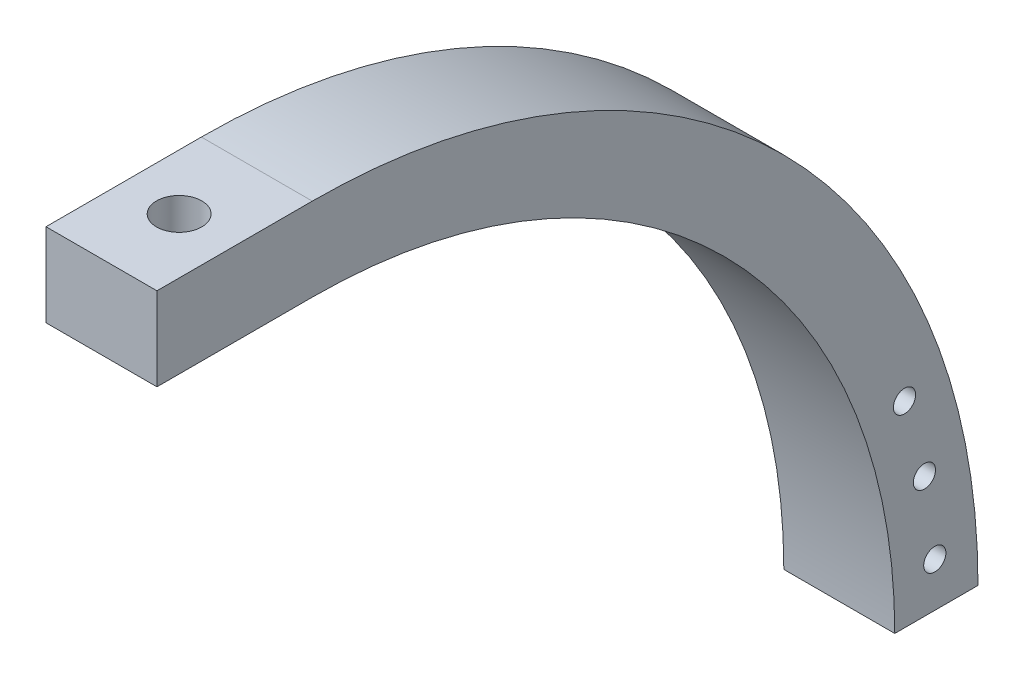
ISO-10303-21;
HEADER;
FILE_DESCRIPTION(('STEP AP214'),'2;1');
FILE_NAME('part.step','',(''),(''),'','','');
FILE_SCHEMA(('AUTOMOTIVE_DESIGN { 1 0 10303 214 1 1 1 1 }'));
ENDSEC;
DATA;
#1=APPLICATION_CONTEXT('core data for automotive mechanical design processes');
#2=APPLICATION_PROTOCOL_DEFINITION('international standard','automotive_design',2000,#1);
#3=PRODUCT_CONTEXT('',#1,'mechanical');
#4=PRODUCT('Part','Part','',(#3));
#5=PRODUCT_RELATED_PRODUCT_CATEGORY('part','',(#4));
#6=PRODUCT_DEFINITION_FORMATION('','',#4);
#7=PRODUCT_DEFINITION_CONTEXT('part definition',#1,'design');
#8=PRODUCT_DEFINITION('design','',#6,#7);
#9=PRODUCT_DEFINITION_SHAPE('','',#8);
#10=(LENGTH_UNIT() NAMED_UNIT(*) SI_UNIT(.MILLI.,.METRE.));
#11=(NAMED_UNIT(*) PLANE_ANGLE_UNIT() SI_UNIT($,.RADIAN.));
#12=(NAMED_UNIT(*) SI_UNIT($,.STERADIAN.) SOLID_ANGLE_UNIT());
#13=UNCERTAINTY_MEASURE_WITH_UNIT(LENGTH_MEASURE(1.E-05),#10,'distance_accuracy_value','');
#14=(GEOMETRIC_REPRESENTATION_CONTEXT(3) GLOBAL_UNCERTAINTY_ASSIGNED_CONTEXT((#13)) GLOBAL_UNIT_ASSIGNED_CONTEXT((#10,
#11,#12)) REPRESENTATION_CONTEXT('',''));
#15=CARTESIAN_POINT('',(0.,0.,0.));
#16=DIRECTION('',(0.,0.,1.));
#17=DIRECTION('',(1.,0.,0.));
#18=AXIS2_PLACEMENT_3D('',#15,#16,#17);
#19=CARTESIAN_POINT('',(0.,9.05,0.));
#20=DIRECTION('',(0.,1.,0.));
#21=DIRECTION('',(0.,0.,1.));
#22=AXIS2_PLACEMENT_3D('',#19,#20,#21);
#23=PLANE('',#22);
#24=DIRECTION('',(0.,0.,-1.));
#25=VECTOR('',#24,1.);
#26=CARTESIAN_POINT('',(-10.,9.05000000000002,-14.));
#27=LINE('',#26,#25);
#28=CARTESIAN_POINT('',(-10.,9.05000000000002,-119.));
#29=VERTEX_POINT('',#28);
#30=CARTESIAN_POINT('',(-10.,9.05000000000002,-134.));
#31=VERTEX_POINT('',#30);
#32=EDGE_CURVE('E12',#29,#31,#27,.T.);
#33=ORIENTED_EDGE('',*,*,#32,.T.);
#34=DIRECTION('',(1.,0.,0.));
#35=VECTOR('',#34,1.);
#36=CARTESIAN_POINT('',(-10.,9.05,-134.));
#37=LINE('',#36,#35);
#38=CARTESIAN_POINT('',(10.,9.05000000000002,-134.));
#39=VERTEX_POINT('',#38);
#40=EDGE_CURVE('E45',#31,#39,#37,.T.);
#41=ORIENTED_EDGE('',*,*,#40,.T.);
#42=DIRECTION('',(0.,0.,-1.));
#43=VECTOR('',#42,1.);
#44=CARTESIAN_POINT('',(10.,9.05000000000002,-14.));
#45=LINE('',#44,#43);
#46=CARTESIAN_POINT('',(10.,9.05000000000002,-119.));
#47=VERTEX_POINT('',#46);
#48=EDGE_CURVE('E59',#47,#39,#45,.T.);
#49=ORIENTED_EDGE('',*,*,#48,.F.);
#50=DIRECTION('',(1.,0.,0.));
#51=VECTOR('',#50,1.);
#52=CARTESIAN_POINT('',(-10.,9.05,-119.));
#53=LINE('',#52,#51);
#54=EDGE_CURVE('E52',#47,#29,#53,.F.);
#55=ORIENTED_EDGE('',*,*,#54,.T.);
#56=EDGE_LOOP('',(#33,#41,#49,#55));
#57=FACE_BOUND('',#56,.T.);
#58=ADVANCED_FACE('F38',(#57),#23,.F.);
#59=CARTESIAN_POINT('',(-10.,117.05,-14.));
#60=DIRECTION('',(0.,-1.,0.));
#61=DIRECTION('',(0.,0.,-1.));
#62=AXIS2_PLACEMENT_3D('',#59,#60,#61);
#63=PLANE('',#62);
#64=CARTESIAN_POINT('',(0.,117.05,0.));
#65=DIRECTION('',(0.,1.,0.));
#66=DIRECTION('',(0.,0.,1.));
#67=AXIS2_PLACEMENT_3D('',#64,#65,#66);
#68=CIRCLE('',#67,1.675);
#69=CARTESIAN_POINT('',(0.,117.05,1.67499999999994));
#70=VERTEX_POINT('',#69);
#71=EDGE_CURVE('E218',#70,#70,#68,.T.);
#72=ORIENTED_EDGE('',*,*,#71,.F.);
#73=EDGE_LOOP('',(#72));
#74=FACE_BOUND('',#73,.T.);
#75=CARTESIAN_POINT('',(0.,117.05,0.));
#76=DIRECTION('',(0.,-1.,0.));
#77=DIRECTION('',(0.,0.,-1.));
#78=AXIS2_PLACEMENT_3D('',#75,#76,#77);
#79=CIRCLE('',#78,4.075);
#80=CARTESIAN_POINT('',(0.,117.05,-4.075));
#81=VERTEX_POINT('',#80);
#82=EDGE_CURVE('E231',#81,#81,#79,.F.);
#83=ORIENTED_EDGE('',*,*,#82,.T.);
#84=EDGE_LOOP('',(#83));
#85=FACE_BOUND('',#84,.T.);
#86=ADVANCED_FACE('F174',(#74,#85),#63,.F.);
#87=CARTESIAN_POINT('',(0.,109.31238456605,0.));
#88=DIRECTION('',(0.,1.,0.));
#89=DIRECTION('',(0.,0.,1.));
#90=AXIS2_PLACEMENT_3D('',#87,#88,#89);
#91=CYLINDRICAL_SURFACE('',#90,1.675);
#92=ORIENTED_EDGE('',*,*,#71,.T.);
#93=EDGE_LOOP('',(#92));
#94=FACE_BOUND('',#93,.T.);
#95=CARTESIAN_POINT('',(0.,114.05,0.));
#96=DIRECTION('',(0.,-1.,0.));
#97=DIRECTION('',(0.,0.,-1.));
#98=AXIS2_PLACEMENT_3D('',#95,#96,#97);
#99=CIRCLE('',#98,1.675);
#100=CARTESIAN_POINT('',(0.,114.05,-1.67500000000006));
#101=VERTEX_POINT('',#100);
#102=EDGE_CURVE('E221',#101,#101,#99,.F.);
#103=ORIENTED_EDGE('',*,*,#102,.F.);
#104=EDGE_LOOP('',(#103));
#105=FACE_BOUND('',#104,.T.);
#106=ADVANCED_FACE('F178',(#94,#105),#91,.F.);
#107=CARTESIAN_POINT('',(0.,102.524159466659,0.));
#108=DIRECTION('',(0.,1.,0.));
#109=DIRECTION('',(0.,0.,1.));
#110=AXIS2_PLACEMENT_3D('',#107,#108,#109);
#111=CYLINDRICAL_SURFACE('',#110,4.075);
#112=CARTESIAN_POINT('',(0.,129.05,0.));
#113=DIRECTION('',(0.,1.,0.));
#114=DIRECTION('',(0.,0.,1.));
#115=AXIS2_PLACEMENT_3D('',#112,#113,#114);
#116=CIRCLE('',#115,4.075);
#117=CARTESIAN_POINT('',(0.,129.05,4.075));
#118=VERTEX_POINT('',#117);
#119=EDGE_CURVE('E228',#118,#118,#116,.T.);
#120=ORIENTED_EDGE('',*,*,#119,.T.);
#121=EDGE_LOOP('',(#120));
#122=FACE_BOUND('',#121,.T.);
#123=ORIENTED_EDGE('',*,*,#82,.F.);
#124=EDGE_LOOP('',(#123));
#125=FACE_BOUND('',#124,.T.);
#126=ADVANCED_FACE('F170',(#122,#125),#111,.F.);
#127=CARTESIAN_POINT('',(-10.,114.05,-14.));
#128=DIRECTION('',(0.,-1.,0.));
#129=DIRECTION('',(0.,0.,-1.));
#130=AXIS2_PLACEMENT_3D('',#127,#128,#129);
#131=PLANE('',#130);
#132=ORIENTED_EDGE('',*,*,#102,.T.);
#133=EDGE_LOOP('',(#132));
#134=FACE_BOUND('',#133,.T.);
#135=DIRECTION('',(1.,0.,0.));
#136=VECTOR('',#135,1.);
#137=CARTESIAN_POINT('',(-10.,114.05,-14.));
#138=LINE('',#137,#136);
#139=CARTESIAN_POINT('',(-10.,114.05,-14.));
#140=VERTEX_POINT('',#139);
#141=CARTESIAN_POINT('',(10.,114.05,-14.));
#142=VERTEX_POINT('',#141);
#143=EDGE_CURVE('E130',#140,#142,#138,.T.);
#144=ORIENTED_EDGE('',*,*,#143,.T.);
#145=DIRECTION('',(0.,0.,-1.));
#146=VECTOR('',#145,1.);
#147=CARTESIAN_POINT('',(10.,114.05,-14.));
#148=LINE('',#147,#146);
#149=CARTESIAN_POINT('',(10.,114.05,14.));
#150=VERTEX_POINT('',#149);
#151=EDGE_CURVE('E114',#150,#142,#148,.T.);
#152=ORIENTED_EDGE('',*,*,#151,.F.);
#153=DIRECTION('',(1.,0.,0.));
#154=VECTOR('',#153,1.);
#155=CARTESIAN_POINT('',(-10.,114.05,14.));
#156=LINE('',#155,#154);
#157=CARTESIAN_POINT('',(-10.,114.05,14.));
#158=VERTEX_POINT('',#157);
#159=EDGE_CURVE('E132',#158,#150,#156,.T.);
#160=ORIENTED_EDGE('',*,*,#159,.F.);
#161=DIRECTION('',(0.,0.,-1.));
#162=VECTOR('',#161,1.);
#163=CARTESIAN_POINT('',(-10.,114.05,-14.));
#164=LINE('',#163,#162);
#165=EDGE_CURVE('E109',#158,#140,#164,.T.);
#166=ORIENTED_EDGE('',*,*,#165,.T.);
#167=EDGE_LOOP('',(#144,#152,#160,#166));
#168=FACE_BOUND('',#167,.T.);
#169=ADVANCED_FACE('F158',(#134,#168),#131,.T.);
#170=CARTESIAN_POINT('',(-10.,114.05,14.));
#171=DIRECTION('',(0.,0.,1.));
#172=DIRECTION('',(1.,0.,0.));
#173=AXIS2_PLACEMENT_3D('',#170,#171,#172);
#174=PLANE('',#173);
#175=ORIENTED_EDGE('',*,*,#159,.T.);
#176=DIRECTION('',(0.,-1.,0.));
#177=VECTOR('',#176,1.);
#178=CARTESIAN_POINT('',(10.,114.05,14.));
#179=LINE('',#178,#177);
#180=CARTESIAN_POINT('',(10.,129.05,14.));
#181=VERTEX_POINT('',#180);
#182=EDGE_CURVE('E112',#181,#150,#179,.T.);
#183=ORIENTED_EDGE('',*,*,#182,.F.);
#184=DIRECTION('',(1.,0.,0.));
#185=VECTOR('',#184,1.);
#186=CARTESIAN_POINT('',(-10.,129.05,14.));
#187=LINE('',#186,#185);
#188=CARTESIAN_POINT('',(-10.,129.05,14.));
#189=VERTEX_POINT('',#188);
#190=EDGE_CURVE('E108',#189,#181,#187,.T.);
#191=ORIENTED_EDGE('',*,*,#190,.F.);
#192=DIRECTION('',(0.,-1.,0.));
#193=VECTOR('',#192,1.);
#194=CARTESIAN_POINT('',(-10.,114.05,14.));
#195=LINE('',#194,#193);
#196=EDGE_CURVE('E125',#189,#158,#195,.T.);
#197=ORIENTED_EDGE('',*,*,#196,.T.);
#198=EDGE_LOOP('',(#175,#183,#191,#197));
#199=FACE_BOUND('',#198,.T.);
#200=ADVANCED_FACE('F160',(#199),#174,.T.);
#201=CARTESIAN_POINT('',(-10.,129.05,14.));
#202=DIRECTION('',(0.,1.,0.));
#203=DIRECTION('',(0.,0.,1.));
#204=AXIS2_PLACEMENT_3D('',#201,#202,#203);
#205=PLANE('',#204);
#206=ORIENTED_EDGE('',*,*,#119,.F.);
#207=EDGE_LOOP('',(#206));
#208=FACE_BOUND('',#207,.T.);
#209=ORIENTED_EDGE('',*,*,#190,.T.);
#210=DIRECTION('',(0.,0.,1.));
#211=VECTOR('',#210,1.);
#212=CARTESIAN_POINT('',(10.,129.05,14.));
#213=LINE('',#212,#211);
#214=CARTESIAN_POINT('',(10.,129.05,-14.));
#215=VERTEX_POINT('',#214);
#216=EDGE_CURVE('E95',#215,#181,#213,.T.);
#217=ORIENTED_EDGE('',*,*,#216,.F.);
#218=DIRECTION('',(1.,0.,0.));
#219=VECTOR('',#218,1.);
#220=CARTESIAN_POINT('',(-10.,129.05,-14.));
#221=LINE('',#220,#219);
#222=CARTESIAN_POINT('',(-10.,129.05,-14.));
#223=VERTEX_POINT('',#222);
#224=EDGE_CURVE('E101',#223,#215,#221,.T.);
#225=ORIENTED_EDGE('',*,*,#224,.F.);
#226=DIRECTION('',(0.,0.,1.));
#227=VECTOR('',#226,1.);
#228=CARTESIAN_POINT('',(-10.,129.05,14.));
#229=LINE('',#228,#227);
#230=EDGE_CURVE('E123',#223,#189,#229,.T.);
#231=ORIENTED_EDGE('',*,*,#230,.T.);
#232=EDGE_LOOP('',(#209,#217,#225,#231));
#233=FACE_BOUND('',#232,.T.);
#234=ADVANCED_FACE('F111',(#208,#233),#205,.T.);
#235=CARTESIAN_POINT('',(-10.,9.05000000000002,-14.));
#236=DIRECTION('',(1.,0.,0.));
#237=DIRECTION('',(0.,0.,-1.));
#238=AXIS2_PLACEMENT_3D('',#235,#236,#237);
#239=CYLINDRICAL_SURFACE('',#238,120.);
#240=ORIENTED_EDGE('',*,*,#40,.F.);
#241=CARTESIAN_POINT('',(-10.,9.05000000000002,-14.));
#242=DIRECTION('',(1.,0.,0.));
#243=DIRECTION('',(0.,0.,1.));
#244=AXIS2_PLACEMENT_3D('',#241,#242,#243);
#245=CIRCLE('',#244,120.);
#246=EDGE_CURVE('E104',#31,#223,#245,.T.);
#247=ORIENTED_EDGE('',*,*,#246,.T.);
#248=ORIENTED_EDGE('',*,*,#224,.T.);
#249=CARTESIAN_POINT('',(10.,9.05000000000002,-14.));
#250=DIRECTION('',(1.,0.,0.));
#251=DIRECTION('',(0.,0.,1.));
#252=AXIS2_PLACEMENT_3D('',#249,#250,#251);
#253=CIRCLE('',#252,120.);
#254=EDGE_CURVE('E90',#39,#215,#253,.T.);
#255=ORIENTED_EDGE('',*,*,#254,.F.);
#256=EDGE_LOOP('',(#240,#247,#248,#255));
#257=FACE_BOUND('',#256,.T.);
#258=ADVANCED_FACE('F102',(#257),#239,.T.);
#259=CARTESIAN_POINT('',(-10.,9.05000000000002,-14.));
#260=DIRECTION('',(1.,0.,0.));
#261=DIRECTION('',(0.,0.,-1.));
#262=AXIS2_PLACEMENT_3D('',#259,#260,#261);
#263=CYLINDRICAL_SURFACE('',#262,105.);
#264=ORIENTED_EDGE('',*,*,#54,.F.);
#265=CARTESIAN_POINT('',(10.,9.05000000000002,-14.));
#266=DIRECTION('',(-1.,0.,0.));
#267=DIRECTION('',(0.,0.,1.));
#268=AXIS2_PLACEMENT_3D('',#265,#266,#267);
#269=CIRCLE('',#268,105.);
#270=EDGE_CURVE('E98',#142,#47,#269,.T.);
#271=ORIENTED_EDGE('',*,*,#270,.F.);
#272=ORIENTED_EDGE('',*,*,#143,.F.);
#273=CARTESIAN_POINT('',(-10.,9.05000000000002,-14.));
#274=DIRECTION('',(-1.,0.,0.));
#275=DIRECTION('',(0.,0.,1.));
#276=AXIS2_PLACEMENT_3D('',#273,#274,#275);
#277=CIRCLE('',#276,105.);
#278=EDGE_CURVE('E120',#140,#29,#277,.T.);
#279=ORIENTED_EDGE('',*,*,#278,.T.);
#280=EDGE_LOOP('',(#264,#271,#272,#279));
#281=FACE_BOUND('',#280,.T.);
#282=ADVANCED_FACE('F155',(#281),#263,.F.);
#283=CARTESIAN_POINT('',(-99.5,17.05,-126.213761495822));
#284=DIRECTION('',(1.,0.,0.));
#285=DIRECTION('',(0.,0.,-1.));
#286=AXIS2_PLACEMENT_3D('',#283,#284,#285);
#287=CYLINDRICAL_SURFACE('',#286,2.);
#288=CARTESIAN_POINT('',(-9.99999999999999,17.05,-126.213761495822));
#289=DIRECTION('',(-1.,0.,0.));
#290=DIRECTION('',(0.,0.,1.));
#291=AXIS2_PLACEMENT_3D('',#288,#289,#290);
#292=CIRCLE('',#291,2.);
#293=CARTESIAN_POINT('',(-9.99999999999998,17.05,-128.213761495822));
#294=VERTEX_POINT('',#293);
#295=EDGE_CURVE('E138',#294,#294,#292,.T.);
#296=CARTESIAN_POINT('',(9.99999999999999,17.05,-126.213761495822));
#297=DIRECTION('',(-1.,0.,0.));
#298=DIRECTION('',(0.,0.,1.));
#299=AXIS2_PLACEMENT_3D('',#296,#297,#298);
#300=CIRCLE('',#299,2.);
#301=CARTESIAN_POINT('',(10.,17.05,-128.213761495822));
#302=VERTEX_POINT('',#301);
#303=EDGE_CURVE('E135',#302,#302,#300,.T.);
#304=CARTESIAN_POINT('',(-9.99999999999998,17.05,-128.213761495822));
#305=CARTESIAN_POINT('',(-9.79166666666665,17.05,-128.213761495822));
#306=CARTESIAN_POINT('',(-9.58333333333331,17.05,-128.213761495822));
#307=CARTESIAN_POINT('',(-9.16666666666665,17.05,-128.213761495822));
#308=CARTESIAN_POINT('',(-8.95833333333331,17.05,-128.213761495822));
#309=CARTESIAN_POINT('',(-8.54166666666665,17.05,-128.213761495822));
#310=CARTESIAN_POINT('',(-8.33333333333331,17.05,-128.213761495822));
#311=CARTESIAN_POINT('',(-7.91666666666665,17.05,-128.213761495822));
#312=CARTESIAN_POINT('',(-7.70833333333331,17.05,-128.213761495822));
#313=CARTESIAN_POINT('',(-7.29166666666664,17.05,-128.213761495822));
#314=CARTESIAN_POINT('',(-7.08333333333331,17.05,-128.213761495822));
#315=CARTESIAN_POINT('',(-6.66666666666664,17.05,-128.213761495822));
#316=CARTESIAN_POINT('',(-6.45833333333331,17.05,-128.213761495822));
#317=CARTESIAN_POINT('',(-6.04166666666664,17.05,-128.213761495822));
#318=CARTESIAN_POINT('',(-5.83333333333331,17.05,-128.213761495822));
#319=CARTESIAN_POINT('',(-5.41666666666664,17.05,-128.213761495822));
#320=CARTESIAN_POINT('',(-5.20833333333331,17.05,-128.213761495822));
#321=CARTESIAN_POINT('',(-4.79166666666665,17.05,-128.213761495822));
#322=CARTESIAN_POINT('',(-4.58333333333332,17.05,-128.213761495822));
#323=CARTESIAN_POINT('',(-4.16666666666666,17.05,-128.213761495822));
#324=CARTESIAN_POINT('',(-3.95833333333332,17.05,-128.213761495822));
#325=CARTESIAN_POINT('',(-3.54166666666666,17.05,-128.213761495822));
#326=CARTESIAN_POINT('',(-3.33333333333332,17.05,-128.213761495822));
#327=CARTESIAN_POINT('',(-2.91666666666666,17.05,-128.213761495822));
#328=CARTESIAN_POINT('',(-2.70833333333332,17.05,-128.213761495822));
#329=CARTESIAN_POINT('',(-2.29166666666665,17.05,-128.213761495822));
#330=CARTESIAN_POINT('',(-2.08333333333332,17.05,-128.213761495822));
#331=CARTESIAN_POINT('',(-1.66666666666665,17.05,-128.213761495822));
#332=CARTESIAN_POINT('',(-1.45833333333332,17.05,-128.213761495822));
#333=CARTESIAN_POINT('',(-1.04166666666665,17.05,-128.213761495822));
#334=CARTESIAN_POINT('',(-0.83333333333332,17.05,-128.213761495822));
#335=CARTESIAN_POINT('',(-0.416666666666653,17.05,-128.213761495822));
#336=CARTESIAN_POINT('',(-0.20833333333332,17.05,-128.213761495822));
#337=CARTESIAN_POINT('',(0.208333333333347,17.05,-128.213761495822));
#338=CARTESIAN_POINT('',(0.416666666666681,17.05,-128.213761495822));
#339=CARTESIAN_POINT('',(0.833333333333348,17.05,-128.213761495822));
#340=CARTESIAN_POINT('',(1.04166666666668,17.05,-128.213761495822));
#341=CARTESIAN_POINT('',(1.45833333333335,17.05,-128.213761495822));
#342=CARTESIAN_POINT('',(1.66666666666668,17.05,-128.213761495822));
#343=CARTESIAN_POINT('',(2.08333333333335,17.05,-128.213761495822));
#344=CARTESIAN_POINT('',(2.29166666666668,17.05,-128.213761495822));
#345=CARTESIAN_POINT('',(2.70833333333335,17.05,-128.213761495822));
#346=CARTESIAN_POINT('',(2.91666666666668,17.05,-128.213761495822));
#347=CARTESIAN_POINT('',(3.33333333333335,17.05,-128.213761495822));
#348=CARTESIAN_POINT('',(3.54166666666668,17.05,-128.213761495822));
#349=CARTESIAN_POINT('',(3.95833333333335,17.05,-128.213761495822));
#350=CARTESIAN_POINT('',(4.16666666666668,17.05,-128.213761495822));
#351=CARTESIAN_POINT('',(4.58333333333335,17.05,-128.213761495822));
#352=CARTESIAN_POINT('',(4.79166666666668,17.05,-128.213761495822));
#353=CARTESIAN_POINT('',(5.20833333333334,17.05,-128.213761495822));
#354=CARTESIAN_POINT('',(5.41666666666668,17.05,-128.213761495822));
#355=CARTESIAN_POINT('',(5.83333333333335,17.05,-128.213761495822));
#356=CARTESIAN_POINT('',(6.04166666666668,17.05,-128.213761495822));
#357=CARTESIAN_POINT('',(6.45833333333334,17.05,-128.213761495822));
#358=CARTESIAN_POINT('',(6.66666666666667,17.05,-128.213761495822));
#359=CARTESIAN_POINT('',(7.08333333333334,17.05,-128.213761495822));
#360=CARTESIAN_POINT('',(7.29166666666667,17.05,-128.213761495822));
#361=CARTESIAN_POINT('',(7.70833333333334,17.05,-128.213761495822));
#362=CARTESIAN_POINT('',(7.91666666666667,17.05,-128.213761495822));
#363=CARTESIAN_POINT('',(8.33333333333334,17.05,-128.213761495822));
#364=CARTESIAN_POINT('',(8.54166666666667,17.05,-128.213761495822));
#365=CARTESIAN_POINT('',(8.95833333333334,17.05,-128.213761495822));
#366=CARTESIAN_POINT('',(9.16666666666667,17.05,-128.213761495822));
#367=CARTESIAN_POINT('',(9.58333333333334,17.05,-128.213761495822));
#368=CARTESIAN_POINT('',(9.79166666666668,17.05,-128.213761495822));
#369=CARTESIAN_POINT('',(10.,17.05,-128.213761495822));
#370=B_SPLINE_CURVE_WITH_KNOTS('',3,(#304,#305,#306,#307,#308,#309,#310,#311,#312,#313,#314,
#315,#316,#317,#318,#319,#320,#321,#322,#323,#324,#325,#326,#327,#328,#329,#330,#331,#332,#333,
#334,#335,#336,#337,#338,#339,#340,#341,#342,#343,#344,#345,#346,#347,#348,#349,#350,#351,#352,
#353,#354,#355,#356,#357,#358,#359,#360,#361,#362,#363,#364,#365,#366,#367,#368,#369),
.UNSPECIFIED.,.F.,.F.,(4,2,2,2,2,2,2,2,2,2,2,2,2,2,2,2,2,2,2,2,2,2,2,2,2,2,2,2,2,2,2,2,4),(0.,
0.625000000000001,1.25,1.875,2.5,3.125,3.75,4.375,5.,5.62499999999999,6.24999999999999,
6.87499999999999,7.49999999999999,8.12499999999999,8.74999999999999,9.37499999999999,
9.99999999999999,10.625,11.25,11.875,12.5,13.125,13.75,14.375,15.,15.625,16.25,16.875,17.5,
18.125,18.75,19.375,20.),.UNSPECIFIED.);
#371=EDGE_CURVE('BSEAM196',#294,#302,#370,.T.);
#372=ORIENTED_EDGE('',*,*,#295,.T.);
#373=ORIENTED_EDGE('',*,*,#303,.F.);
#374=ORIENTED_EDGE('',*,*,#371,.T.);
#375=ORIENTED_EDGE('',*,*,#371,.F.);
#376=EDGE_LOOP('',(#372,#374,#373,#375));
#377=FACE_BOUND('',#376,.T.);
#378=ADVANCED_FACE('F196',(#377),#287,.F.);
#379=CARTESIAN_POINT('',(-99.5,30.9243003232221,-124.341920011871));
#380=DIRECTION('',(1.,0.,0.));
#381=DIRECTION('',(0.,0.,-1.));
#382=AXIS2_PLACEMENT_3D('',#379,#380,#381);
#383=CYLINDRICAL_SURFACE('',#382,2.);
#384=CARTESIAN_POINT('',(-9.99999999999999,30.9243003232221,-124.341920011871));
#385=DIRECTION('',(-1.,0.,0.));
#386=DIRECTION('',(0.,0.,1.));
#387=AXIS2_PLACEMENT_3D('',#384,#385,#386);
#388=CIRCLE('',#387,2.);
#389=CARTESIAN_POINT('',(-9.99999999999998,30.9243003232221,-126.341920011871));
#390=VERTEX_POINT('',#389);
#391=EDGE_CURVE('E142',#390,#390,#388,.T.);
#392=CARTESIAN_POINT('',(9.99999999999999,30.9243003232221,-124.341920011871));
#393=DIRECTION('',(-1.,0.,0.));
#394=DIRECTION('',(0.,0.,1.));
#395=AXIS2_PLACEMENT_3D('',#392,#393,#394);
#396=CIRCLE('',#395,2.);
#397=CARTESIAN_POINT('',(10.,30.9243003232221,-126.341920011871));
#398=VERTEX_POINT('',#397);
#399=EDGE_CURVE('E139',#398,#398,#396,.T.);
#400=CARTESIAN_POINT('',(-9.99999999999998,30.9243003232221,-126.341920011871));
#401=CARTESIAN_POINT('',(-9.79166666666665,30.9243003232221,-126.341920011871));
#402=CARTESIAN_POINT('',(-9.58333333333331,30.9243003232221,-126.341920011871));
#403=CARTESIAN_POINT('',(-9.16666666666665,30.9243003232221,-126.341920011871));
#404=CARTESIAN_POINT('',(-8.95833333333331,30.9243003232221,-126.341920011871));
#405=CARTESIAN_POINT('',(-8.54166666666665,30.9243003232221,-126.341920011871));
#406=CARTESIAN_POINT('',(-8.33333333333331,30.9243003232221,-126.341920011871));
#407=CARTESIAN_POINT('',(-7.91666666666665,30.9243003232221,-126.341920011871));
#408=CARTESIAN_POINT('',(-7.70833333333331,30.9243003232221,-126.341920011871));
#409=CARTESIAN_POINT('',(-7.29166666666664,30.9243003232221,-126.341920011871));
#410=CARTESIAN_POINT('',(-7.08333333333331,30.9243003232221,-126.341920011871));
#411=CARTESIAN_POINT('',(-6.66666666666664,30.9243003232221,-126.341920011871));
#412=CARTESIAN_POINT('',(-6.45833333333331,30.9243003232221,-126.341920011871));
#413=CARTESIAN_POINT('',(-6.04166666666664,30.9243003232221,-126.341920011871));
#414=CARTESIAN_POINT('',(-5.83333333333331,30.9243003232221,-126.341920011871));
#415=CARTESIAN_POINT('',(-5.41666666666664,30.9243003232221,-126.341920011871));
#416=CARTESIAN_POINT('',(-5.20833333333331,30.9243003232221,-126.341920011871));
#417=CARTESIAN_POINT('',(-4.79166666666665,30.9243003232221,-126.341920011871));
#418=CARTESIAN_POINT('',(-4.58333333333332,30.9243003232221,-126.341920011871));
#419=CARTESIAN_POINT('',(-4.16666666666666,30.9243003232221,-126.341920011871));
#420=CARTESIAN_POINT('',(-3.95833333333332,30.9243003232221,-126.341920011871));
#421=CARTESIAN_POINT('',(-3.54166666666666,30.9243003232221,-126.341920011871));
#422=CARTESIAN_POINT('',(-3.33333333333332,30.9243003232221,-126.341920011871));
#423=CARTESIAN_POINT('',(-2.91666666666666,30.9243003232221,-126.341920011871));
#424=CARTESIAN_POINT('',(-2.70833333333332,30.9243003232221,-126.341920011871));
#425=CARTESIAN_POINT('',(-2.29166666666665,30.9243003232221,-126.341920011871));
#426=CARTESIAN_POINT('',(-2.08333333333332,30.9243003232221,-126.341920011871));
#427=CARTESIAN_POINT('',(-1.66666666666665,30.9243003232221,-126.341920011871));
#428=CARTESIAN_POINT('',(-1.45833333333332,30.9243003232221,-126.341920011871));
#429=CARTESIAN_POINT('',(-1.04166666666665,30.9243003232221,-126.341920011871));
#430=CARTESIAN_POINT('',(-0.83333333333332,30.9243003232221,-126.341920011871));
#431=CARTESIAN_POINT('',(-0.416666666666653,30.9243003232221,-126.341920011871));
#432=CARTESIAN_POINT('',(-0.20833333333332,30.9243003232221,-126.341920011871));
#433=CARTESIAN_POINT('',(0.208333333333347,30.9243003232221,-126.341920011871));
#434=CARTESIAN_POINT('',(0.416666666666681,30.9243003232221,-126.341920011871));
#435=CARTESIAN_POINT('',(0.833333333333348,30.9243003232221,-126.341920011871));
#436=CARTESIAN_POINT('',(1.04166666666668,30.9243003232221,-126.341920011871));
#437=CARTESIAN_POINT('',(1.45833333333335,30.9243003232221,-126.341920011871));
#438=CARTESIAN_POINT('',(1.66666666666668,30.9243003232221,-126.341920011871));
#439=CARTESIAN_POINT('',(2.08333333333335,30.9243003232221,-126.341920011871));
#440=CARTESIAN_POINT('',(2.29166666666668,30.9243003232221,-126.341920011871));
#441=CARTESIAN_POINT('',(2.70833333333335,30.9243003232221,-126.341920011871));
#442=CARTESIAN_POINT('',(2.91666666666668,30.9243003232221,-126.341920011871));
#443=CARTESIAN_POINT('',(3.33333333333335,30.9243003232221,-126.341920011871));
#444=CARTESIAN_POINT('',(3.54166666666668,30.9243003232221,-126.341920011871));
#445=CARTESIAN_POINT('',(3.95833333333335,30.9243003232221,-126.341920011871));
#446=CARTESIAN_POINT('',(4.16666666666668,30.9243003232221,-126.341920011871));
#447=CARTESIAN_POINT('',(4.58333333333335,30.9243003232221,-126.341920011871));
#448=CARTESIAN_POINT('',(4.79166666666668,30.9243003232221,-126.341920011871));
#449=CARTESIAN_POINT('',(5.20833333333334,30.9243003232221,-126.341920011871));
#450=CARTESIAN_POINT('',(5.41666666666668,30.9243003232221,-126.341920011871));
#451=CARTESIAN_POINT('',(5.83333333333335,30.9243003232221,-126.341920011871));
#452=CARTESIAN_POINT('',(6.04166666666668,30.9243003232221,-126.341920011871));
#453=CARTESIAN_POINT('',(6.45833333333334,30.9243003232221,-126.341920011871));
#454=CARTESIAN_POINT('',(6.66666666666667,30.9243003232221,-126.341920011871));
#455=CARTESIAN_POINT('',(7.08333333333334,30.9243003232221,-126.341920011871));
#456=CARTESIAN_POINT('',(7.29166666666667,30.9243003232221,-126.341920011871));
#457=CARTESIAN_POINT('',(7.70833333333334,30.9243003232221,-126.341920011871));
#458=CARTESIAN_POINT('',(7.91666666666667,30.9243003232221,-126.341920011871));
#459=CARTESIAN_POINT('',(8.33333333333334,30.9243003232221,-126.341920011871));
#460=CARTESIAN_POINT('',(8.54166666666667,30.9243003232221,-126.341920011871));
#461=CARTESIAN_POINT('',(8.95833333333334,30.9243003232221,-126.341920011871));
#462=CARTESIAN_POINT('',(9.16666666666667,30.9243003232221,-126.341920011871));
#463=CARTESIAN_POINT('',(9.58333333333334,30.9243003232221,-126.341920011871));
#464=CARTESIAN_POINT('',(9.79166666666668,30.9243003232221,-126.341920011871));
#465=CARTESIAN_POINT('',(10.,30.9243003232221,-126.341920011871));
#466=B_SPLINE_CURVE_WITH_KNOTS('',3,(#400,#401,#402,#403,#404,#405,#406,#407,#408,#409,#410,
#411,#412,#413,#414,#415,#416,#417,#418,#419,#420,#421,#422,#423,#424,#425,#426,#427,#428,#429,
#430,#431,#432,#433,#434,#435,#436,#437,#438,#439,#440,#441,#442,#443,#444,#445,#446,#447,#448,
#449,#450,#451,#452,#453,#454,#455,#456,#457,#458,#459,#460,#461,#462,#463,#464,#465),
.UNSPECIFIED.,.F.,.F.,(4,2,2,2,2,2,2,2,2,2,2,2,2,2,2,2,2,2,2,2,2,2,2,2,2,2,2,2,2,2,2,2,4),(0.,
0.625000000000001,1.25,1.875,2.5,3.125,3.75,4.375,5.,5.62499999999999,6.24999999999999,
6.87499999999999,7.49999999999999,8.12499999999999,8.74999999999999,9.37499999999999,
9.99999999999999,10.625,11.25,11.875,12.5,13.125,13.75,14.375,15.,15.625,16.25,16.875,17.5,
18.125,18.75,19.375,20.),.UNSPECIFIED.);
#467=EDGE_CURVE('BSEAM199',#390,#398,#466,.T.);
#468=ORIENTED_EDGE('',*,*,#391,.T.);
#469=ORIENTED_EDGE('',*,*,#399,.F.);
#470=ORIENTED_EDGE('',*,*,#467,.T.);
#471=ORIENTED_EDGE('',*,*,#467,.F.);
#472=EDGE_LOOP('',(#468,#470,#469,#471));
#473=FACE_BOUND('',#472,.T.);
#474=ADVANCED_FACE('F199',(#473),#383,.F.);
#475=CARTESIAN_POINT('',(-99.5,44.4564359955439,-120.752866634464));
#476=DIRECTION('',(1.,0.,0.));
#477=DIRECTION('',(0.,0.,-1.));
#478=AXIS2_PLACEMENT_3D('',#475,#476,#477);
#479=CYLINDRICAL_SURFACE('',#478,2.);
#480=CARTESIAN_POINT('',(-9.99999999999999,44.4564359955439,-120.752866634464));
#481=DIRECTION('',(-1.,0.,0.));
#482=DIRECTION('',(0.,0.,1.));
#483=AXIS2_PLACEMENT_3D('',#480,#481,#482);
#484=CIRCLE('',#483,2.);
#485=CARTESIAN_POINT('',(-9.99999999999998,44.4564359955439,-122.752866634464));
#486=VERTEX_POINT('',#485);
#487=EDGE_CURVE('E146',#486,#486,#484,.T.);
#488=CARTESIAN_POINT('',(9.99999999999999,44.4564359955439,-120.752866634464));
#489=DIRECTION('',(-1.,0.,0.));
#490=DIRECTION('',(0.,0.,1.));
#491=AXIS2_PLACEMENT_3D('',#488,#489,#490);
#492=CIRCLE('',#491,2.);
#493=CARTESIAN_POINT('',(10.,44.4564359955439,-122.752866634464));
#494=VERTEX_POINT('',#493);
#495=EDGE_CURVE('E143',#494,#494,#492,.T.);
#496=CARTESIAN_POINT('',(-9.99999999999998,44.4564359955439,-122.752866634464));
#497=CARTESIAN_POINT('',(-9.79166666666665,44.4564359955439,-122.752866634464));
#498=CARTESIAN_POINT('',(-9.58333333333331,44.4564359955439,-122.752866634464));
#499=CARTESIAN_POINT('',(-9.16666666666665,44.4564359955439,-122.752866634464));
#500=CARTESIAN_POINT('',(-8.95833333333331,44.4564359955439,-122.752866634464));
#501=CARTESIAN_POINT('',(-8.54166666666665,44.4564359955439,-122.752866634464));
#502=CARTESIAN_POINT('',(-8.33333333333331,44.4564359955439,-122.752866634464));
#503=CARTESIAN_POINT('',(-7.91666666666665,44.4564359955439,-122.752866634464));
#504=CARTESIAN_POINT('',(-7.70833333333331,44.4564359955439,-122.752866634464));
#505=CARTESIAN_POINT('',(-7.29166666666664,44.4564359955439,-122.752866634464));
#506=CARTESIAN_POINT('',(-7.08333333333331,44.4564359955439,-122.752866634464));
#507=CARTESIAN_POINT('',(-6.66666666666664,44.4564359955439,-122.752866634464));
#508=CARTESIAN_POINT('',(-6.45833333333331,44.4564359955439,-122.752866634464));
#509=CARTESIAN_POINT('',(-6.04166666666664,44.4564359955439,-122.752866634464));
#510=CARTESIAN_POINT('',(-5.83333333333331,44.4564359955439,-122.752866634464));
#511=CARTESIAN_POINT('',(-5.41666666666664,44.4564359955439,-122.752866634464));
#512=CARTESIAN_POINT('',(-5.20833333333331,44.4564359955439,-122.752866634464));
#513=CARTESIAN_POINT('',(-4.79166666666665,44.4564359955439,-122.752866634464));
#514=CARTESIAN_POINT('',(-4.58333333333332,44.4564359955439,-122.752866634464));
#515=CARTESIAN_POINT('',(-4.16666666666666,44.4564359955439,-122.752866634464));
#516=CARTESIAN_POINT('',(-3.95833333333332,44.4564359955439,-122.752866634464));
#517=CARTESIAN_POINT('',(-3.54166666666666,44.4564359955439,-122.752866634464));
#518=CARTESIAN_POINT('',(-3.33333333333332,44.4564359955439,-122.752866634464));
#519=CARTESIAN_POINT('',(-2.91666666666666,44.4564359955439,-122.752866634464));
#520=CARTESIAN_POINT('',(-2.70833333333332,44.4564359955439,-122.752866634464));
#521=CARTESIAN_POINT('',(-2.29166666666665,44.4564359955439,-122.752866634464));
#522=CARTESIAN_POINT('',(-2.08333333333332,44.4564359955439,-122.752866634464));
#523=CARTESIAN_POINT('',(-1.66666666666665,44.4564359955439,-122.752866634464));
#524=CARTESIAN_POINT('',(-1.45833333333332,44.4564359955439,-122.752866634464));
#525=CARTESIAN_POINT('',(-1.04166666666665,44.4564359955439,-122.752866634464));
#526=CARTESIAN_POINT('',(-0.83333333333332,44.4564359955439,-122.752866634464));
#527=CARTESIAN_POINT('',(-0.416666666666653,44.4564359955439,-122.752866634464));
#528=CARTESIAN_POINT('',(-0.20833333333332,44.4564359955439,-122.752866634464));
#529=CARTESIAN_POINT('',(0.208333333333347,44.4564359955439,-122.752866634464));
#530=CARTESIAN_POINT('',(0.416666666666681,44.4564359955439,-122.752866634464));
#531=CARTESIAN_POINT('',(0.833333333333348,44.4564359955439,-122.752866634464));
#532=CARTESIAN_POINT('',(1.04166666666668,44.4564359955439,-122.752866634464));
#533=CARTESIAN_POINT('',(1.45833333333335,44.4564359955439,-122.752866634464));
#534=CARTESIAN_POINT('',(1.66666666666668,44.4564359955439,-122.752866634464));
#535=CARTESIAN_POINT('',(2.08333333333335,44.4564359955439,-122.752866634464));
#536=CARTESIAN_POINT('',(2.29166666666668,44.4564359955439,-122.752866634464));
#537=CARTESIAN_POINT('',(2.70833333333335,44.4564359955439,-122.752866634464));
#538=CARTESIAN_POINT('',(2.91666666666668,44.4564359955439,-122.752866634464));
#539=CARTESIAN_POINT('',(3.33333333333335,44.4564359955439,-122.752866634464));
#540=CARTESIAN_POINT('',(3.54166666666668,44.4564359955439,-122.752866634464));
#541=CARTESIAN_POINT('',(3.95833333333335,44.4564359955439,-122.752866634464));
#542=CARTESIAN_POINT('',(4.16666666666668,44.4564359955439,-122.752866634464));
#543=CARTESIAN_POINT('',(4.58333333333335,44.4564359955439,-122.752866634464));
#544=CARTESIAN_POINT('',(4.79166666666668,44.4564359955439,-122.752866634464));
#545=CARTESIAN_POINT('',(5.20833333333334,44.4564359955439,-122.752866634464));
#546=CARTESIAN_POINT('',(5.41666666666668,44.4564359955439,-122.752866634464));
#547=CARTESIAN_POINT('',(5.83333333333335,44.4564359955439,-122.752866634464));
#548=CARTESIAN_POINT('',(6.04166666666668,44.4564359955439,-122.752866634464));
#549=CARTESIAN_POINT('',(6.45833333333334,44.4564359955439,-122.752866634464));
#550=CARTESIAN_POINT('',(6.66666666666667,44.4564359955439,-122.752866634464));
#551=CARTESIAN_POINT('',(7.08333333333334,44.4564359955439,-122.752866634464));
#552=CARTESIAN_POINT('',(7.29166666666667,44.4564359955439,-122.752866634464));
#553=CARTESIAN_POINT('',(7.70833333333334,44.4564359955439,-122.752866634464));
#554=CARTESIAN_POINT('',(7.91666666666667,44.4564359955439,-122.752866634464));
#555=CARTESIAN_POINT('',(8.33333333333334,44.4564359955439,-122.752866634464));
#556=CARTESIAN_POINT('',(8.54166666666667,44.4564359955439,-122.752866634464));
#557=CARTESIAN_POINT('',(8.95833333333334,44.4564359955439,-122.752866634464));
#558=CARTESIAN_POINT('',(9.16666666666667,44.4564359955439,-122.752866634464));
#559=CARTESIAN_POINT('',(9.58333333333334,44.4564359955439,-122.752866634464));
#560=CARTESIAN_POINT('',(9.79166666666668,44.4564359955439,-122.752866634464));
#561=CARTESIAN_POINT('',(10.,44.4564359955439,-122.752866634464));
#562=B_SPLINE_CURVE_WITH_KNOTS('',3,(#496,#497,#498,#499,#500,#501,#502,#503,#504,#505,#506,
#507,#508,#509,#510,#511,#512,#513,#514,#515,#516,#517,#518,#519,#520,#521,#522,#523,#524,#525,
#526,#527,#528,#529,#530,#531,#532,#533,#534,#535,#536,#537,#538,#539,#540,#541,#542,#543,#544,
#545,#546,#547,#548,#549,#550,#551,#552,#553,#554,#555,#556,#557,#558,#559,#560,#561),
.UNSPECIFIED.,.F.,.F.,(4,2,2,2,2,2,2,2,2,2,2,2,2,2,2,2,2,2,2,2,2,2,2,2,2,2,2,2,2,2,2,2,4),(0.,
0.625000000000001,1.25,1.875,2.5,3.125,3.75,4.375,5.,5.62499999999999,6.24999999999999,
6.87499999999999,7.49999999999999,8.12499999999999,8.74999999999999,9.37499999999999,
9.99999999999999,10.625,11.25,11.875,12.5,13.125,13.75,14.375,15.,15.625,16.25,16.875,17.5,
18.125,18.75,19.375,20.),.UNSPECIFIED.);
#563=EDGE_CURVE('BSEAM186',#486,#494,#562,.T.);
#564=ORIENTED_EDGE('',*,*,#487,.T.);
#565=ORIENTED_EDGE('',*,*,#495,.F.);
#566=ORIENTED_EDGE('',*,*,#563,.T.);
#567=ORIENTED_EDGE('',*,*,#563,.F.);
#568=EDGE_LOOP('',(#564,#566,#565,#567));
#569=FACE_BOUND('',#568,.T.);
#570=ADVANCED_FACE('F186',(#569),#479,.F.);
#571=CARTESIAN_POINT('',(10.,9.05000000000002,-14.));
#572=DIRECTION('',(-1.,0.,0.));
#573=DIRECTION('',(0.,0.,1.));
#574=AXIS2_PLACEMENT_3D('',#571,#572,#573);
#575=PLANE('',#574);
#576=ORIENTED_EDGE('',*,*,#495,.T.);
#577=EDGE_LOOP('',(#576));
#578=FACE_BOUND('',#577,.T.);
#579=ORIENTED_EDGE('',*,*,#399,.T.);
#580=EDGE_LOOP('',(#579));
#581=FACE_BOUND('',#580,.T.);
#582=ORIENTED_EDGE('',*,*,#303,.T.);
#583=EDGE_LOOP('',(#582));
#584=FACE_BOUND('',#583,.T.);
#585=ORIENTED_EDGE('',*,*,#270,.T.);
#586=ORIENTED_EDGE('',*,*,#48,.T.);
#587=ORIENTED_EDGE('',*,*,#254,.T.);
#588=ORIENTED_EDGE('',*,*,#216,.T.);
#589=ORIENTED_EDGE('',*,*,#182,.T.);
#590=ORIENTED_EDGE('',*,*,#151,.T.);
#591=EDGE_LOOP('',(#585,#586,#587,#588,#589,#590));
#592=FACE_BOUND('',#591,.T.);
#593=ADVANCED_FACE('F92',(#578,#581,#584,#592),#575,.F.);
#594=CARTESIAN_POINT('',(-10.,9.05000000000002,-14.));
#595=DIRECTION('',(-1.,0.,0.));
#596=DIRECTION('',(0.,0.,1.));
#597=AXIS2_PLACEMENT_3D('',#594,#595,#596);
#598=PLANE('',#597);
#599=ORIENTED_EDGE('',*,*,#32,.F.);
#600=ORIENTED_EDGE('',*,*,#278,.F.);
#601=ORIENTED_EDGE('',*,*,#165,.F.);
#602=ORIENTED_EDGE('',*,*,#196,.F.);
#603=ORIENTED_EDGE('',*,*,#230,.F.);
#604=ORIENTED_EDGE('',*,*,#246,.F.);
#605=EDGE_LOOP('',(#599,#600,#601,#602,#603,#604));
#606=FACE_BOUND('',#605,.T.);
#607=ORIENTED_EDGE('',*,*,#487,.F.);
#608=EDGE_LOOP('',(#607));
#609=FACE_BOUND('',#608,.T.);
#610=ORIENTED_EDGE('',*,*,#391,.F.);
#611=EDGE_LOOP('',(#610));
#612=FACE_BOUND('',#611,.T.);
#613=ORIENTED_EDGE('',*,*,#295,.F.);
#614=EDGE_LOOP('',(#613));
#615=FACE_BOUND('',#614,.T.);
#616=ADVANCED_FACE('F152',(#606,#609,#612,#615),#598,.T.);
#617=CLOSED_SHELL('',(#58,#86,#106,#126,#169,#200,#234,#258,#282,#378,#474,#570,#593,#616));
#618=MANIFOLD_SOLID_BREP('B2',#617);
#619=ADVANCED_BREP_SHAPE_REPRESENTATION('',(#18,#618),#14);
#620=SHAPE_DEFINITION_REPRESENTATION(#9,#619);
ENDSEC;
END-ISO-10303-21;
